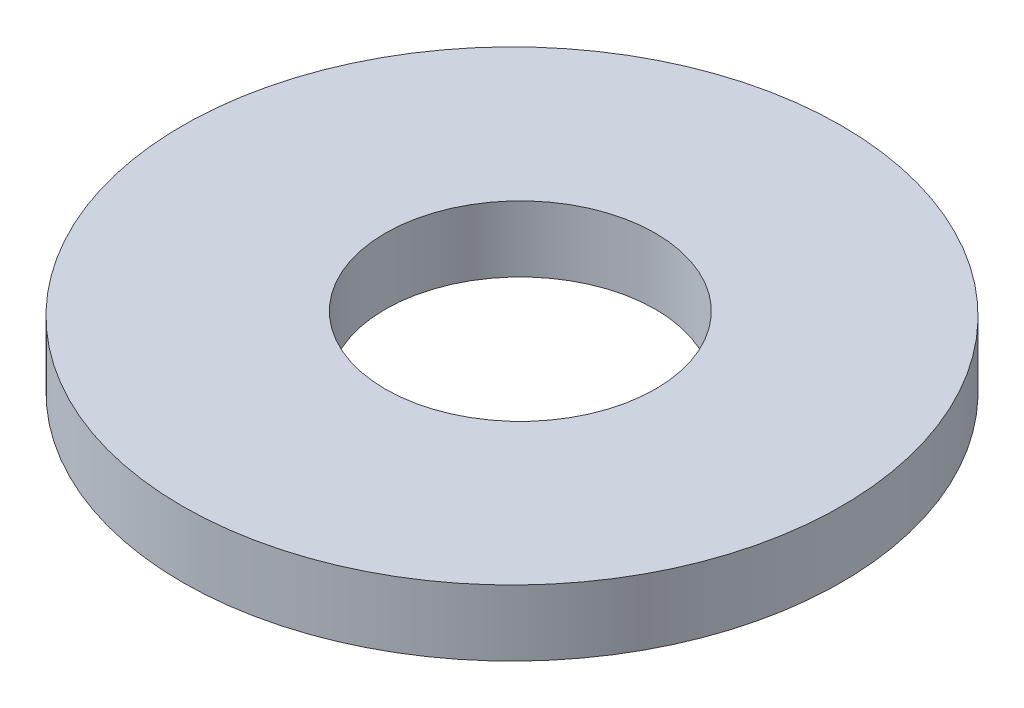
ISO-10303-21;
HEADER;
FILE_DESCRIPTION(('STEP AP214'),'2;1');
FILE_NAME('part.step','',(''),(''),'','','');
FILE_SCHEMA(('AUTOMOTIVE_DESIGN { 1 0 10303 214 1 1 1 1 }'));
ENDSEC;
DATA;
#1=APPLICATION_CONTEXT('core data for automotive mechanical design processes');
#2=APPLICATION_PROTOCOL_DEFINITION('international standard','automotive_design',2000,#1);
#3=PRODUCT_CONTEXT('',#1,'mechanical');
#4=PRODUCT('Part','Part','',(#3));
#5=PRODUCT_RELATED_PRODUCT_CATEGORY('part','',(#4));
#6=PRODUCT_DEFINITION_FORMATION('','',#4);
#7=PRODUCT_DEFINITION_CONTEXT('part definition',#1,'design');
#8=PRODUCT_DEFINITION('design','',#6,#7);
#9=PRODUCT_DEFINITION_SHAPE('','',#8);
#10=(LENGTH_UNIT() NAMED_UNIT(*) SI_UNIT(.MILLI.,.METRE.));
#11=(NAMED_UNIT(*) PLANE_ANGLE_UNIT() SI_UNIT($,.RADIAN.));
#12=(NAMED_UNIT(*) SI_UNIT($,.STERADIAN.) SOLID_ANGLE_UNIT());
#13=UNCERTAINTY_MEASURE_WITH_UNIT(LENGTH_MEASURE(1.E-05),#10,'distance_accuracy_value','');
#14=(GEOMETRIC_REPRESENTATION_CONTEXT(3) GLOBAL_UNCERTAINTY_ASSIGNED_CONTEXT((#13)) GLOBAL_UNIT_ASSIGNED_CONTEXT((#10,
#11,#12)) REPRESENTATION_CONTEXT('',''));
#15=CARTESIAN_POINT('',(0.,0.,0.));
#16=DIRECTION('',(0.,0.,1.));
#17=DIRECTION('',(1.,0.,0.));
#18=AXIS2_PLACEMENT_3D('',#15,#16,#17);
#19=CARTESIAN_POINT('',(0.,10.,0.));
#20=DIRECTION('',(0.,-1.,0.));
#21=DIRECTION('',(0.,0.,-1.));
#22=AXIS2_PLACEMENT_3D('',#19,#20,#21);
#23=CYLINDRICAL_SURFACE('',#22,50.);
#24=CARTESIAN_POINT('',(0.,10.,0.));
#25=DIRECTION('',(0.,1.,0.));
#26=DIRECTION('',(0.,0.,1.));
#27=AXIS2_PLACEMENT_3D('',#24,#25,#26);
#28=CIRCLE('',#27,50.);
#29=CARTESIAN_POINT('',(0.,10.,50.));
#30=VERTEX_POINT('',#29);
#31=EDGE_CURVE('E10',#30,#30,#28,.T.);
#32=ORIENTED_EDGE('',*,*,#31,.F.);
#33=EDGE_LOOP('',(#32));
#34=FACE_BOUND('',#33,.T.);
#35=CARTESIAN_POINT('',(0.,0.,0.));
#36=DIRECTION('',(0.,1.,0.));
#37=DIRECTION('',(0.,0.,1.));
#38=AXIS2_PLACEMENT_3D('',#35,#36,#37);
#39=CIRCLE('',#38,50.);
#40=CARTESIAN_POINT('',(0.,0.,50.));
#41=VERTEX_POINT('',#40);
#42=EDGE_CURVE('E34',#41,#41,#39,.T.);
#43=ORIENTED_EDGE('',*,*,#42,.T.);
#44=EDGE_LOOP('',(#43));
#45=FACE_BOUND('',#44,.T.);
#46=ADVANCED_FACE('F31',(#34,#45),#23,.T.);
#47=CARTESIAN_POINT('',(0.,10.,0.));
#48=DIRECTION('',(0.,1.,0.));
#49=DIRECTION('',(0.,0.,1.));
#50=AXIS2_PLACEMENT_3D('',#47,#48,#49);
#51=PLANE('',#50);
#52=CARTESIAN_POINT('',(0.,10.,-1.2656465813734));
#53=DIRECTION('',(0.,1.,0.));
#54=DIRECTION('',(0.,0.,1.));
#55=AXIS2_PLACEMENT_3D('',#52,#53,#54);
#56=CIRCLE('',#55,20.4924169527754);
#57=CARTESIAN_POINT('',(0.,10.,19.226770371402));
#58=VERTEX_POINT('',#57);
#59=EDGE_CURVE('E43',#58,#58,#56,.T.);
#60=ORIENTED_EDGE('',*,*,#59,.F.);
#61=EDGE_LOOP('',(#60));
#62=FACE_BOUND('',#61,.T.);
#63=ORIENTED_EDGE('',*,*,#31,.T.);
#64=EDGE_LOOP('',(#63));
#65=FACE_BOUND('',#64,.T.);
#66=ADVANCED_FACE('F58',(#62,#65),#51,.T.);
#67=CARTESIAN_POINT('',(0.,0.,0.));
#68=DIRECTION('',(0.,1.,0.));
#69=DIRECTION('',(0.,0.,1.));
#70=AXIS2_PLACEMENT_3D('',#67,#68,#69);
#71=PLANE('',#70);
#72=CARTESIAN_POINT('',(0.,0.,-1.2656465813734));
#73=DIRECTION('',(0.,1.,0.));
#74=DIRECTION('',(0.,0.,1.));
#75=AXIS2_PLACEMENT_3D('',#72,#73,#74);
#76=CIRCLE('',#75,20.4924169527754);
#77=CARTESIAN_POINT('',(0.,0.,19.226770371402));
#78=VERTEX_POINT('',#77);
#79=EDGE_CURVE('E41',#78,#78,#76,.T.);
#80=ORIENTED_EDGE('',*,*,#79,.T.);
#81=EDGE_LOOP('',(#80));
#82=FACE_BOUND('',#81,.T.);
#83=ORIENTED_EDGE('',*,*,#42,.F.);
#84=EDGE_LOOP('',(#83));
#85=FACE_BOUND('',#84,.T.);
#86=ADVANCED_FACE('F49',(#82,#85),#71,.F.);
#87=CARTESIAN_POINT('',(0.,0.,-1.2656465813734));
#88=DIRECTION('',(0.,1.,0.));
#89=DIRECTION('',(0.,0.,1.));
#90=AXIS2_PLACEMENT_3D('',#87,#88,#89);
#91=CYLINDRICAL_SURFACE('',#90,20.4924169527754);
#92=ORIENTED_EDGE('',*,*,#79,.F.);
#93=EDGE_LOOP('',(#92));
#94=FACE_BOUND('',#93,.T.);
#95=ORIENTED_EDGE('',*,*,#59,.T.);
#96=EDGE_LOOP('',(#95));
#97=FACE_BOUND('',#96,.T.);
#98=ADVANCED_FACE('F52',(#94,#97),#91,.F.);
#99=CLOSED_SHELL('',(#46,#66,#86,#98));
#100=MANIFOLD_SOLID_BREP('B2',#99);
#101=ADVANCED_BREP_SHAPE_REPRESENTATION('',(#18,#100),#14);
#102=SHAPE_DEFINITION_REPRESENTATION(#9,#101);
ENDSEC;
END-ISO-10303-21;
